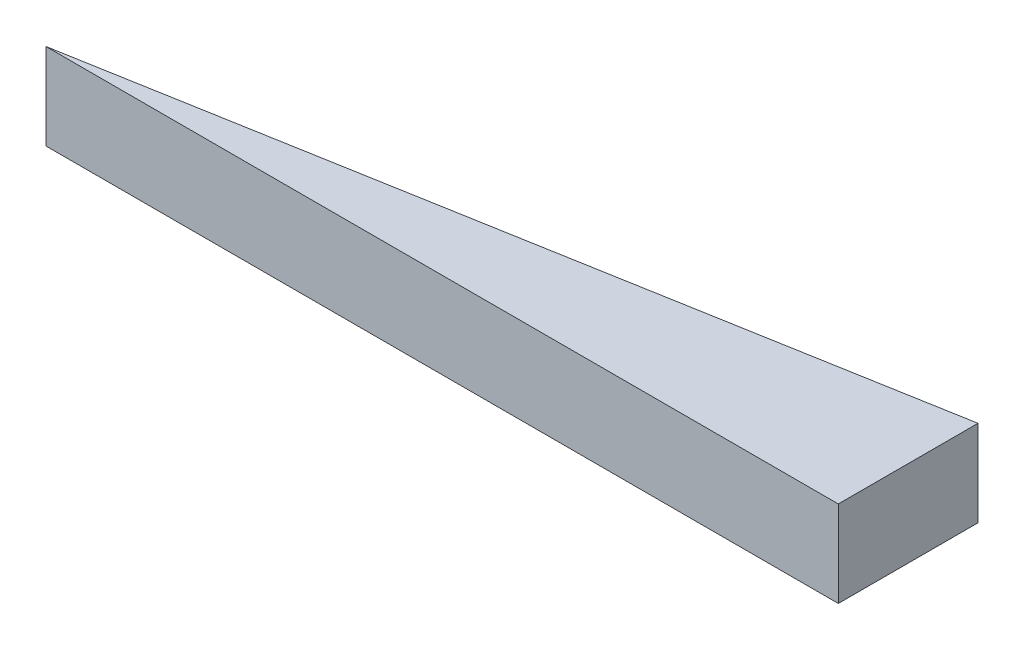
ISO-10303-21;
HEADER;
FILE_DESCRIPTION(('STEP AP214'),'2;1');
FILE_NAME('part.step','',(''),(''),'','','');
FILE_SCHEMA(('AUTOMOTIVE_DESIGN { 1 0 10303 214 1 1 1 1 }'));
ENDSEC;
DATA;
#1=APPLICATION_CONTEXT('core data for automotive mechanical design processes');
#2=APPLICATION_PROTOCOL_DEFINITION('international standard','automotive_design',2000,#1);
#3=PRODUCT_CONTEXT('',#1,'mechanical');
#4=PRODUCT('Part','Part','',(#3));
#5=PRODUCT_RELATED_PRODUCT_CATEGORY('part','',(#4));
#6=PRODUCT_DEFINITION_FORMATION('','',#4);
#7=PRODUCT_DEFINITION_CONTEXT('part definition',#1,'design');
#8=PRODUCT_DEFINITION('design','',#6,#7);
#9=PRODUCT_DEFINITION_SHAPE('','',#8);
#10=(LENGTH_UNIT() NAMED_UNIT(*) SI_UNIT(.MILLI.,.METRE.));
#11=(NAMED_UNIT(*) PLANE_ANGLE_UNIT() SI_UNIT($,.RADIAN.));
#12=(NAMED_UNIT(*) SI_UNIT($,.STERADIAN.) SOLID_ANGLE_UNIT());
#13=UNCERTAINTY_MEASURE_WITH_UNIT(LENGTH_MEASURE(1.E-05),#10,'distance_accuracy_value','');
#14=(GEOMETRIC_REPRESENTATION_CONTEXT(3) GLOBAL_UNCERTAINTY_ASSIGNED_CONTEXT((#13)) GLOBAL_UNIT_ASSIGNED_CONTEXT((#10,
#11,#12)) REPRESENTATION_CONTEXT('',''));
#15=CARTESIAN_POINT('',(0.,0.,0.));
#16=DIRECTION('',(0.,0.,1.));
#17=DIRECTION('',(1.,0.,0.));
#18=AXIS2_PLACEMENT_3D('',#15,#16,#17);
#19=CARTESIAN_POINT('',(178.73977411697,19.05,-30.8746459891804));
#20=DIRECTION('',(-1.,0.,0.));
#21=DIRECTION('',(0.,0.,1.));
#22=AXIS2_PLACEMENT_3D('',#19,#20,#21);
#23=PLANE('',#22);
#24=DIRECTION('',(0.,0.,-1.));
#25=VECTOR('',#24,1.);
#26=CARTESIAN_POINT('',(178.73977411697,0.,-30.8746459891804));
#27=LINE('',#26,#25);
#28=CARTESIAN_POINT('',(178.73977411697,0.,0.));
#29=VERTEX_POINT('',#28);
#30=CARTESIAN_POINT('',(178.73977411697,0.,-30.8746459891804));
#31=VERTEX_POINT('',#30);
#32=EDGE_CURVE('E86',#29,#31,#27,.T.);
#33=ORIENTED_EDGE('',*,*,#32,.T.);
#34=DIRECTION('',(0.,-1.,0.));
#35=VECTOR('',#34,1.);
#36=CARTESIAN_POINT('',(178.73977411697,19.05,-30.8746459891804));
#37=LINE('',#36,#35);
#38=CARTESIAN_POINT('',(178.73977411697,19.05,-30.8746459891804));
#39=VERTEX_POINT('',#38);
#40=EDGE_CURVE('E11',#39,#31,#37,.T.);
#41=ORIENTED_EDGE('',*,*,#40,.F.);
#42=DIRECTION('',(0.,0.,-1.));
#43=VECTOR('',#42,1.);
#44=CARTESIAN_POINT('',(178.73977411697,19.05,-30.8746459891804));
#45=LINE('',#44,#43);
#46=CARTESIAN_POINT('',(178.73977411697,19.05,0.));
#47=VERTEX_POINT('',#46);
#48=EDGE_CURVE('E80',#47,#39,#45,.T.);
#49=ORIENTED_EDGE('',*,*,#48,.F.);
#50=DIRECTION('',(0.,-1.,0.));
#51=VECTOR('',#50,1.);
#52=CARTESIAN_POINT('',(178.73977411697,19.05,0.));
#53=LINE('',#52,#51);
#54=EDGE_CURVE('E90',#47,#29,#53,.T.);
#55=ORIENTED_EDGE('',*,*,#54,.T.);
#56=EDGE_LOOP('',(#33,#41,#49,#55));
#57=FACE_BOUND('',#56,.T.);
#58=ADVANCED_FACE('F39',(#57),#23,.F.);
#59=CARTESIAN_POINT('',(3.64095563139935,19.05,0.));
#60=DIRECTION('',(0.173648177666931,0.,0.984807753012208));
#61=DIRECTION('',(0.984807753012208,0.,-0.173648177666931));
#62=AXIS2_PLACEMENT_3D('',#59,#60,#61);
#63=PLANE('',#62);
#64=DIRECTION('',(-0.984807753012208,0.,0.173648177666931));
#65=VECTOR('',#64,1.);
#66=CARTESIAN_POINT('',(3.64095563139935,0.,0.));
#67=LINE('',#66,#65);
#68=CARTESIAN_POINT('',(3.64095563139935,0.,0.));
#69=VERTEX_POINT('',#68);
#70=EDGE_CURVE('E70',#31,#69,#67,.T.);
#71=ORIENTED_EDGE('',*,*,#70,.T.);
#72=DIRECTION('',(0.,-1.,0.));
#73=VECTOR('',#72,1.);
#74=CARTESIAN_POINT('',(3.64095563139935,19.05,0.));
#75=LINE('',#74,#73);
#76=CARTESIAN_POINT('',(3.64095563139935,19.05,0.));
#77=VERTEX_POINT('',#76);
#78=EDGE_CURVE('E50',#77,#69,#75,.T.);
#79=ORIENTED_EDGE('',*,*,#78,.F.);
#80=DIRECTION('',(-0.984807753012208,0.,0.173648177666931));
#81=VECTOR('',#80,1.);
#82=CARTESIAN_POINT('',(3.64095563139935,19.05,0.));
#83=LINE('',#82,#81);
#84=EDGE_CURVE('E75',#39,#77,#83,.T.);
#85=ORIENTED_EDGE('',*,*,#84,.F.);
#86=ORIENTED_EDGE('',*,*,#40,.T.);
#87=EDGE_LOOP('',(#71,#79,#85,#86));
#88=FACE_BOUND('',#87,.T.);
#89=ADVANCED_FACE('F78',(#88),#63,.F.);
#90=CARTESIAN_POINT('',(3.64095563139935,19.05,0.));
#91=DIRECTION('',(0.,0.,-1.));
#92=DIRECTION('',(-1.,0.,0.));
#93=AXIS2_PLACEMENT_3D('',#90,#91,#92);
#94=PLANE('',#93);
#95=DIRECTION('',(1.,0.,0.));
#96=VECTOR('',#95,1.);
#97=CARTESIAN_POINT('',(3.64095563139935,0.,0.));
#98=LINE('',#97,#96);
#99=EDGE_CURVE('E72',#69,#29,#98,.T.);
#100=ORIENTED_EDGE('',*,*,#99,.T.);
#101=ORIENTED_EDGE('',*,*,#54,.F.);
#102=DIRECTION('',(1.,0.,0.));
#103=VECTOR('',#102,1.);
#104=CARTESIAN_POINT('',(3.64095563139935,19.05,0.));
#105=LINE('',#104,#103);
#106=EDGE_CURVE('E54',#77,#47,#105,.T.);
#107=ORIENTED_EDGE('',*,*,#106,.F.);
#108=ORIENTED_EDGE('',*,*,#78,.T.);
#109=EDGE_LOOP('',(#100,#101,#107,#108));
#110=FACE_BOUND('',#109,.T.);
#111=ADVANCED_FACE('F92',(#110),#94,.F.);
#112=CARTESIAN_POINT('',(0.,19.05,0.));
#113=DIRECTION('',(0.,1.,0.));
#114=DIRECTION('',(0.,0.,1.));
#115=AXIS2_PLACEMENT_3D('',#112,#113,#114);
#116=PLANE('',#115);
#117=ORIENTED_EDGE('',*,*,#48,.T.);
#118=ORIENTED_EDGE('',*,*,#84,.T.);
#119=ORIENTED_EDGE('',*,*,#106,.T.);
#120=EDGE_LOOP('',(#117,#118,#119));
#121=FACE_BOUND('',#120,.T.);
#122=ADVANCED_FACE('F85',(#121),#116,.T.);
#123=CARTESIAN_POINT('',(0.,0.,0.));
#124=DIRECTION('',(0.,1.,0.));
#125=DIRECTION('',(0.,0.,1.));
#126=AXIS2_PLACEMENT_3D('',#123,#124,#125);
#127=PLANE('',#126);
#128=ORIENTED_EDGE('',*,*,#32,.F.);
#129=ORIENTED_EDGE('',*,*,#99,.F.);
#130=ORIENTED_EDGE('',*,*,#70,.F.);
#131=EDGE_LOOP('',(#128,#129,#130));
#132=FACE_BOUND('',#131,.T.);
#133=ADVANCED_FACE('F94',(#132),#127,.F.);
#134=CLOSED_SHELL('',(#58,#89,#111,#122,#133));
#135=MANIFOLD_SOLID_BREP('B2',#134);
#136=ADVANCED_BREP_SHAPE_REPRESENTATION('',(#18,#135),#14);
#137=SHAPE_DEFINITION_REPRESENTATION(#9,#136);
ENDSEC;
END-ISO-10303-21;
